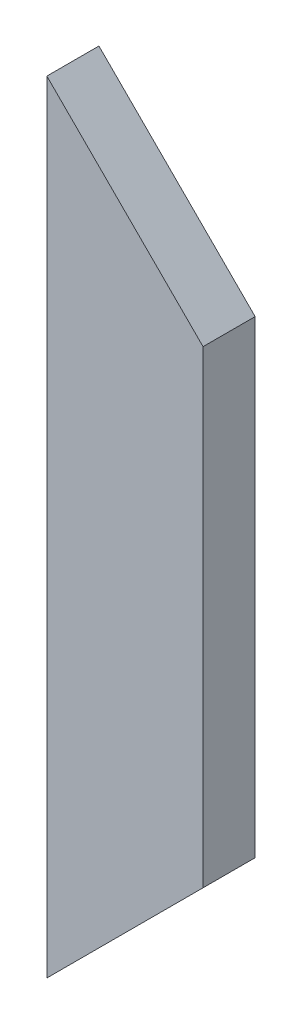
ISO-10303-21;
HEADER;
FILE_DESCRIPTION(('STEP AP214'),'2;1');
FILE_NAME('part.step','',(''),(''),'','','');
FILE_SCHEMA(('AUTOMOTIVE_DESIGN { 1 0 10303 214 1 1 1 1 }'));
ENDSEC;
DATA;
#1=APPLICATION_CONTEXT('core data for automotive mechanical design processes');
#2=APPLICATION_PROTOCOL_DEFINITION('international standard','automotive_design',2000,#1);
#3=PRODUCT_CONTEXT('',#1,'mechanical');
#4=PRODUCT('Part','Part','',(#3));
#5=PRODUCT_RELATED_PRODUCT_CATEGORY('part','',(#4));
#6=PRODUCT_DEFINITION_FORMATION('','',#4);
#7=PRODUCT_DEFINITION_CONTEXT('part definition',#1,'design');
#8=PRODUCT_DEFINITION('design','',#6,#7);
#9=PRODUCT_DEFINITION_SHAPE('','',#8);
#10=(LENGTH_UNIT() NAMED_UNIT(*) SI_UNIT(.MILLI.,.METRE.));
#11=(NAMED_UNIT(*) PLANE_ANGLE_UNIT() SI_UNIT($,.RADIAN.));
#12=(NAMED_UNIT(*) SI_UNIT($,.STERADIAN.) SOLID_ANGLE_UNIT());
#13=UNCERTAINTY_MEASURE_WITH_UNIT(LENGTH_MEASURE(1.E-05),#10,'distance_accuracy_value','');
#14=(GEOMETRIC_REPRESENTATION_CONTEXT(3) GLOBAL_UNCERTAINTY_ASSIGNED_CONTEXT((#13)) GLOBAL_UNIT_ASSIGNED_CONTEXT((#10,
#11,#12)) REPRESENTATION_CONTEXT('',''));
#15=CARTESIAN_POINT('',(0.,0.,0.));
#16=DIRECTION('',(0.,0.,1.));
#17=DIRECTION('',(1.,0.,0.));
#18=AXIS2_PLACEMENT_3D('',#15,#16,#17);
#19=CARTESIAN_POINT('',(38.1,-190.5,25.4));
#20=DIRECTION('',(-1.,0.,0.));
#21=DIRECTION('',(0.,0.,1.));
#22=AXIS2_PLACEMENT_3D('',#19,#20,#21);
#23=PLANE('',#22);
#24=DIRECTION('',(0.,1.,0.));
#25=VECTOR('',#24,1.);
#26=CARTESIAN_POINT('',(38.1,-190.5,0.));
#27=LINE('',#26,#25);
#28=CARTESIAN_POINT('',(38.1,-114.299999999999,0.));
#29=VERTEX_POINT('',#28);
#30=CARTESIAN_POINT('',(38.1,114.300000000001,0.));
#31=VERTEX_POINT('',#30);
#32=EDGE_CURVE('E93',#29,#31,#27,.T.);
#33=ORIENTED_EDGE('',*,*,#32,.T.);
#34=DIRECTION('',(0.,0.,1.));
#35=VECTOR('',#34,1.);
#36=CARTESIAN_POINT('',(38.1,114.300000000001,0.));
#37=LINE('',#36,#35);
#38=CARTESIAN_POINT('',(38.1,114.300000000001,25.4));
#39=VERTEX_POINT('',#38);
#40=EDGE_CURVE('E47',#31,#39,#37,.T.);
#41=ORIENTED_EDGE('',*,*,#40,.T.);
#42=DIRECTION('',(0.,1.,0.));
#43=VECTOR('',#42,1.);
#44=CARTESIAN_POINT('',(38.1,-190.5,25.4));
#45=LINE('',#44,#43);
#46=CARTESIAN_POINT('',(38.1,-114.299999999999,25.4));
#47=VERTEX_POINT('',#46);
#48=EDGE_CURVE('E84',#47,#39,#45,.T.);
#49=ORIENTED_EDGE('',*,*,#48,.F.);
#50=DIRECTION('',(0.,0.,1.));
#51=VECTOR('',#50,1.);
#52=CARTESIAN_POINT('',(38.1,-114.299999999999,0.));
#53=LINE('',#52,#51);
#54=EDGE_CURVE('E85',#29,#47,#53,.T.);
#55=ORIENTED_EDGE('',*,*,#54,.F.);
#56=EDGE_LOOP('',(#33,#41,#49,#55));
#57=FACE_BOUND('',#56,.T.);
#58=ADVANCED_FACE('F33',(#57),#23,.F.);
#59=CARTESIAN_POINT('',(-38.1,-190.5,25.4));
#60=DIRECTION('',(-1.,0.,0.));
#61=DIRECTION('',(0.,0.,1.));
#62=AXIS2_PLACEMENT_3D('',#59,#60,#61);
#63=PLANE('',#62);
#64=DIRECTION('',(0.,1.,0.));
#65=VECTOR('',#64,1.);
#66=CARTESIAN_POINT('',(-38.1,-190.5,0.));
#67=LINE('',#66,#65);
#68=CARTESIAN_POINT('',(-38.1,-190.5,0.));
#69=VERTEX_POINT('',#68);
#70=CARTESIAN_POINT('',(-38.1,190.5,0.));
#71=VERTEX_POINT('',#70);
#72=EDGE_CURVE('E89',#69,#71,#67,.T.);
#73=ORIENTED_EDGE('',*,*,#72,.F.);
#74=DIRECTION('',(0.,0.,-1.));
#75=VECTOR('',#74,1.);
#76=CARTESIAN_POINT('',(-38.1,-190.5,25.4));
#77=LINE('',#76,#75);
#78=CARTESIAN_POINT('',(-38.1,-190.5,25.4));
#79=VERTEX_POINT('',#78);
#80=EDGE_CURVE('E40',#79,#69,#77,.T.);
#81=ORIENTED_EDGE('',*,*,#80,.F.);
#82=DIRECTION('',(0.,1.,0.));
#83=VECTOR('',#82,1.);
#84=CARTESIAN_POINT('',(-38.1,-190.5,25.4));
#85=LINE('',#84,#83);
#86=CARTESIAN_POINT('',(-38.1,190.5,25.4));
#87=VERTEX_POINT('',#86);
#88=EDGE_CURVE('E82',#79,#87,#85,.T.);
#89=ORIENTED_EDGE('',*,*,#88,.T.);
#90=DIRECTION('',(0.,0.,-1.));
#91=VECTOR('',#90,1.);
#92=CARTESIAN_POINT('',(-38.1,190.5,25.4));
#93=LINE('',#92,#91);
#94=EDGE_CURVE('E11',#87,#71,#93,.T.);
#95=ORIENTED_EDGE('',*,*,#94,.T.);
#96=EDGE_LOOP('',(#73,#81,#89,#95));
#97=FACE_BOUND('',#96,.T.);
#98=ADVANCED_FACE('F87',(#97),#63,.T.);
#99=CARTESIAN_POINT('',(0.,0.,25.4));
#100=DIRECTION('',(0.,0.,1.));
#101=DIRECTION('',(1.,0.,0.));
#102=AXIS2_PLACEMENT_3D('',#99,#100,#101);
#103=PLANE('',#102);
#104=DIRECTION('',(0.707106781186552,-0.707106781186543,0.));
#105=VECTOR('',#104,1.);
#106=CARTESIAN_POINT('',(-38.1,190.5,25.4));
#107=LINE('',#106,#105);
#108=EDGE_CURVE('E71',#87,#39,#107,.T.);
#109=ORIENTED_EDGE('',*,*,#108,.F.);
#110=ORIENTED_EDGE('',*,*,#88,.F.);
#111=DIRECTION('',(-0.707106781186543,-0.707106781186552,0.));
#112=VECTOR('',#111,1.);
#113=CARTESIAN_POINT('',(-38.1,-190.5,25.4));
#114=LINE('',#113,#112);
#115=EDGE_CURVE('E101',#47,#79,#114,.T.);
#116=ORIENTED_EDGE('',*,*,#115,.F.);
#117=ORIENTED_EDGE('',*,*,#48,.T.);
#118=EDGE_LOOP('',(#109,#110,#116,#117));
#119=FACE_BOUND('',#118,.T.);
#120=ADVANCED_FACE('F80',(#119),#103,.T.);
#121=CARTESIAN_POINT('',(0.,0.,0.));
#122=DIRECTION('',(0.,0.,1.));
#123=DIRECTION('',(1.,0.,0.));
#124=AXIS2_PLACEMENT_3D('',#121,#122,#123);
#125=PLANE('',#124);
#126=ORIENTED_EDGE('',*,*,#72,.T.);
#127=DIRECTION('',(0.707106781186552,-0.707106781186543,0.));
#128=VECTOR('',#127,1.);
#129=CARTESIAN_POINT('',(-38.1,190.5,0.));
#130=LINE('',#129,#128);
#131=EDGE_CURVE('E72',#71,#31,#130,.T.);
#132=ORIENTED_EDGE('',*,*,#131,.T.);
#133=ORIENTED_EDGE('',*,*,#32,.F.);
#134=DIRECTION('',(-0.707106781186543,-0.707106781186552,0.));
#135=VECTOR('',#134,1.);
#136=CARTESIAN_POINT('',(-38.1,-190.5,0.));
#137=LINE('',#136,#135);
#138=EDGE_CURVE('E99',#29,#69,#137,.T.);
#139=ORIENTED_EDGE('',*,*,#138,.T.);
#140=EDGE_LOOP('',(#126,#132,#133,#139));
#141=FACE_BOUND('',#140,.T.);
#142=ADVANCED_FACE('F97',(#141),#125,.F.);
#143=CARTESIAN_POINT('',(-38.1,-190.5,0.));
#144=DIRECTION('',(-0.707106781186552,0.707106781186543,0.));
#145=DIRECTION('',(-0.707106781186543,-0.707106781186552,0.));
#146=AXIS2_PLACEMENT_3D('',#143,#144,#145);
#147=PLANE('',#146);
#148=ORIENTED_EDGE('',*,*,#115,.T.);
#149=ORIENTED_EDGE('',*,*,#80,.T.);
#150=ORIENTED_EDGE('',*,*,#138,.F.);
#151=ORIENTED_EDGE('',*,*,#54,.T.);
#152=EDGE_LOOP('',(#148,#149,#150,#151));
#153=FACE_BOUND('',#152,.T.);
#154=ADVANCED_FACE('F107',(#153),#147,.F.);
#155=CARTESIAN_POINT('',(-38.1,190.5,0.));
#156=DIRECTION('',(-0.707106781186543,-0.707106781186552,0.));
#157=DIRECTION('',(0.707106781186552,-0.707106781186543,0.));
#158=AXIS2_PLACEMENT_3D('',#155,#156,#157);
#159=PLANE('',#158);
#160=ORIENTED_EDGE('',*,*,#108,.T.);
#161=ORIENTED_EDGE('',*,*,#40,.F.);
#162=ORIENTED_EDGE('',*,*,#131,.F.);
#163=ORIENTED_EDGE('',*,*,#94,.F.);
#164=EDGE_LOOP('',(#160,#161,#162,#163));
#165=FACE_BOUND('',#164,.T.);
#166=ADVANCED_FACE('F70',(#165),#159,.F.);
#167=CLOSED_SHELL('',(#58,#98,#120,#142,#154,#166));
#168=MANIFOLD_SOLID_BREP('B2',#167);
#169=ADVANCED_BREP_SHAPE_REPRESENTATION('',(#18,#168),#14);
#170=SHAPE_DEFINITION_REPRESENTATION(#9,#169);
ENDSEC;
END-ISO-10303-21;
